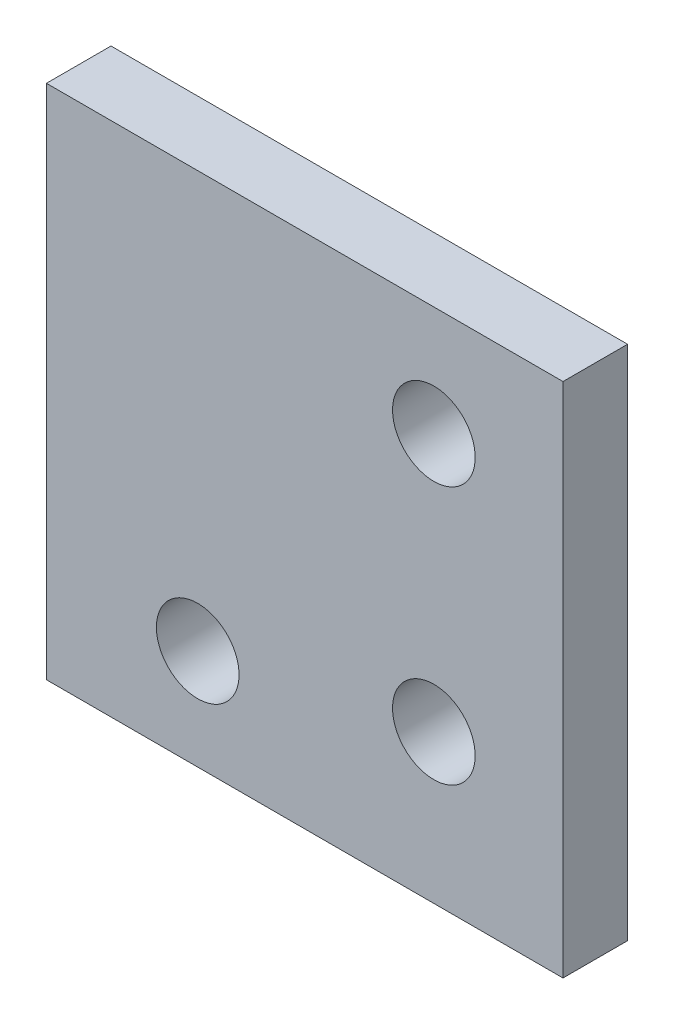
ISO-10303-21;
HEADER;
FILE_DESCRIPTION(('STEP AP214'),'2;1');
FILE_NAME('part.step','',(''),(''),'','','');
FILE_SCHEMA(('AUTOMOTIVE_DESIGN { 1 0 10303 214 1 1 1 1 }'));
ENDSEC;
DATA;
#1=APPLICATION_CONTEXT('core data for automotive mechanical design processes');
#2=APPLICATION_PROTOCOL_DEFINITION('international standard','automotive_design',2000,#1);
#3=PRODUCT_CONTEXT('',#1,'mechanical');
#4=PRODUCT('Part','Part','',(#3));
#5=PRODUCT_RELATED_PRODUCT_CATEGORY('part','',(#4));
#6=PRODUCT_DEFINITION_FORMATION('','',#4);
#7=PRODUCT_DEFINITION_CONTEXT('part definition',#1,'design');
#8=PRODUCT_DEFINITION('design','',#6,#7);
#9=PRODUCT_DEFINITION_SHAPE('','',#8);
#10=(LENGTH_UNIT() NAMED_UNIT(*) SI_UNIT(.MILLI.,.METRE.));
#11=(NAMED_UNIT(*) PLANE_ANGLE_UNIT() SI_UNIT($,.RADIAN.));
#12=(NAMED_UNIT(*) SI_UNIT($,.STERADIAN.) SOLID_ANGLE_UNIT());
#13=UNCERTAINTY_MEASURE_WITH_UNIT(LENGTH_MEASURE(1.E-05),#10,'distance_accuracy_value','');
#14=(GEOMETRIC_REPRESENTATION_CONTEXT(3) GLOBAL_UNCERTAINTY_ASSIGNED_CONTEXT((#13)) GLOBAL_UNIT_ASSIGNED_CONTEXT((#10,
#11,#12)) REPRESENTATION_CONTEXT('',''));
#15=CARTESIAN_POINT('',(0.,0.,0.));
#16=DIRECTION('',(0.,0.,1.));
#17=DIRECTION('',(1.,0.,0.));
#18=AXIS2_PLACEMENT_3D('',#15,#16,#17);
#19=CARTESIAN_POINT('',(12.7,-12.7,3.175));
#20=DIRECTION('',(-1.,0.,0.));
#21=DIRECTION('',(0.,0.,1.));
#22=AXIS2_PLACEMENT_3D('',#19,#20,#21);
#23=PLANE('',#22);
#24=DIRECTION('',(0.,1.,0.));
#25=VECTOR('',#24,1.);
#26=CARTESIAN_POINT('',(12.7,-12.7,0.));
#27=LINE('',#26,#25);
#28=CARTESIAN_POINT('',(12.7,-12.7,0.));
#29=VERTEX_POINT('',#28);
#30=CARTESIAN_POINT('',(12.7,12.7,0.));
#31=VERTEX_POINT('',#30);
#32=EDGE_CURVE('E110',#29,#31,#27,.T.);
#33=ORIENTED_EDGE('',*,*,#32,.T.);
#34=DIRECTION('',(0.,0.,-1.));
#35=VECTOR('',#34,1.);
#36=CARTESIAN_POINT('',(12.7,12.7,3.175));
#37=LINE('',#36,#35);
#38=CARTESIAN_POINT('',(12.7,12.7,3.175));
#39=VERTEX_POINT('',#38);
#40=EDGE_CURVE('E11',#39,#31,#37,.T.);
#41=ORIENTED_EDGE('',*,*,#40,.F.);
#42=DIRECTION('',(0.,1.,0.));
#43=VECTOR('',#42,1.);
#44=CARTESIAN_POINT('',(12.7,-12.7,3.175));
#45=LINE('',#44,#43);
#46=CARTESIAN_POINT('',(12.7,-12.7,3.175));
#47=VERTEX_POINT('',#46);
#48=EDGE_CURVE('E94',#47,#39,#45,.T.);
#49=ORIENTED_EDGE('',*,*,#48,.F.);
#50=DIRECTION('',(0.,0.,-1.));
#51=VECTOR('',#50,1.);
#52=CARTESIAN_POINT('',(12.7,-12.7,3.175));
#53=LINE('',#52,#51);
#54=EDGE_CURVE('E103',#47,#29,#53,.T.);
#55=ORIENTED_EDGE('',*,*,#54,.T.);
#56=EDGE_LOOP('',(#33,#41,#49,#55));
#57=FACE_BOUND('',#56,.T.);
#58=ADVANCED_FACE('F39',(#57),#23,.F.);
#59=CARTESIAN_POINT('',(-12.7,12.7,3.175));
#60=DIRECTION('',(0.,-1.,0.));
#61=DIRECTION('',(0.,0.,-1.));
#62=AXIS2_PLACEMENT_3D('',#59,#60,#61);
#63=PLANE('',#62);
#64=DIRECTION('',(-1.,0.,0.));
#65=VECTOR('',#64,1.);
#66=CARTESIAN_POINT('',(-12.7,12.7,0.));
#67=LINE('',#66,#65);
#68=CARTESIAN_POINT('',(-12.7,12.7,0.));
#69=VERTEX_POINT('',#68);
#70=EDGE_CURVE('E98',#31,#69,#67,.T.);
#71=ORIENTED_EDGE('',*,*,#70,.T.);
#72=DIRECTION('',(0.,0.,-1.));
#73=VECTOR('',#72,1.);
#74=CARTESIAN_POINT('',(-12.7,12.7,3.175));
#75=LINE('',#74,#73);
#76=CARTESIAN_POINT('',(-12.7,12.7,3.175));
#77=VERTEX_POINT('',#76);
#78=EDGE_CURVE('E49',#77,#69,#75,.T.);
#79=ORIENTED_EDGE('',*,*,#78,.F.);
#80=DIRECTION('',(-1.,0.,0.));
#81=VECTOR('',#80,1.);
#82=CARTESIAN_POINT('',(-12.7,12.7,3.175));
#83=LINE('',#82,#81);
#84=EDGE_CURVE('E90',#39,#77,#83,.T.);
#85=ORIENTED_EDGE('',*,*,#84,.F.);
#86=ORIENTED_EDGE('',*,*,#40,.T.);
#87=EDGE_LOOP('',(#71,#79,#85,#86));
#88=FACE_BOUND('',#87,.T.);
#89=ADVANCED_FACE('F100',(#88),#63,.F.);
#90=CARTESIAN_POINT('',(-12.7,-12.7,3.175));
#91=DIRECTION('',(1.,0.,0.));
#92=DIRECTION('',(0.,0.,-1.));
#93=AXIS2_PLACEMENT_3D('',#90,#91,#92);
#94=PLANE('',#93);
#95=DIRECTION('',(0.,-1.,0.));
#96=VECTOR('',#95,1.);
#97=CARTESIAN_POINT('',(-12.7,-12.7,0.));
#98=LINE('',#97,#96);
#99=CARTESIAN_POINT('',(-12.7,-12.7,0.));
#100=VERTEX_POINT('',#99);
#101=EDGE_CURVE('E78',#69,#100,#98,.T.);
#102=ORIENTED_EDGE('',*,*,#101,.T.);
#103=DIRECTION('',(0.,0.,-1.));
#104=VECTOR('',#103,1.);
#105=CARTESIAN_POINT('',(-12.7,-12.7,3.175));
#106=LINE('',#105,#104);
#107=CARTESIAN_POINT('',(-12.7,-12.7,3.175));
#108=VERTEX_POINT('',#107);
#109=EDGE_CURVE('E97',#108,#100,#106,.T.);
#110=ORIENTED_EDGE('',*,*,#109,.F.);
#111=DIRECTION('',(0.,-1.,0.));
#112=VECTOR('',#111,1.);
#113=CARTESIAN_POINT('',(-12.7,-12.7,3.175));
#114=LINE('',#113,#112);
#115=EDGE_CURVE('E95',#77,#108,#114,.T.);
#116=ORIENTED_EDGE('',*,*,#115,.F.);
#117=ORIENTED_EDGE('',*,*,#78,.T.);
#118=EDGE_LOOP('',(#102,#110,#116,#117));
#119=FACE_BOUND('',#118,.T.);
#120=ADVANCED_FACE('F101',(#119),#94,.F.);
#121=CARTESIAN_POINT('',(-12.7,-12.7,3.175));
#122=DIRECTION('',(0.,1.,0.));
#123=DIRECTION('',(0.,0.,1.));
#124=AXIS2_PLACEMENT_3D('',#121,#122,#123);
#125=PLANE('',#124);
#126=DIRECTION('',(1.,0.,0.));
#127=VECTOR('',#126,1.);
#128=CARTESIAN_POINT('',(-12.7,-12.7,0.));
#129=LINE('',#128,#127);
#130=EDGE_CURVE('E84',#100,#29,#129,.T.);
#131=ORIENTED_EDGE('',*,*,#130,.T.);
#132=ORIENTED_EDGE('',*,*,#54,.F.);
#133=DIRECTION('',(1.,0.,0.));
#134=VECTOR('',#133,1.);
#135=CARTESIAN_POINT('',(-12.7,-12.7,3.175));
#136=LINE('',#135,#134);
#137=EDGE_CURVE('E56',#108,#47,#136,.T.);
#138=ORIENTED_EDGE('',*,*,#137,.F.);
#139=ORIENTED_EDGE('',*,*,#109,.T.);
#140=EDGE_LOOP('',(#131,#132,#138,#139));
#141=FACE_BOUND('',#140,.T.);
#142=ADVANCED_FACE('F136',(#141),#125,.F.);
#143=CARTESIAN_POINT('',(0.,0.,3.175));
#144=DIRECTION('',(0.,0.,-1.));
#145=DIRECTION('',(-1.,0.,0.));
#146=AXIS2_PLACEMENT_3D('',#143,#144,#145);
#147=PLANE('',#146);
#148=CARTESIAN_POINT('',(-5.2605122421211,-7.75635386460882,3.175));
#149=DIRECTION('',(0.,0.,-1.));
#150=DIRECTION('',(-1.,0.,0.));
#151=AXIS2_PLACEMENT_3D('',#148,#149,#150);
#152=CIRCLE('',#151,2.03199999999998);
#153=CARTESIAN_POINT('',(-7.29251224212107,-7.75635386460882,3.175));
#154=VERTEX_POINT('',#153);
#155=EDGE_CURVE('E109',#154,#154,#152,.T.);
#156=ORIENTED_EDGE('',*,*,#155,.T.);
#157=EDGE_LOOP('',(#156));
#158=FACE_BOUND('',#157,.T.);
#159=CARTESIAN_POINT('',(6.35000000001718,-5.39686610674717,3.175));
#160=DIRECTION('',(0.,0.,-1.));
#161=DIRECTION('',(-1.,0.,0.));
#162=AXIS2_PLACEMENT_3D('',#159,#160,#161);
#163=CIRCLE('',#162,2.03199999999998);
#164=CARTESIAN_POINT('',(4.3180000000172,-5.39686610674717,3.175));
#165=VERTEX_POINT('',#164);
#166=EDGE_CURVE('E159',#165,#165,#163,.T.);
#167=ORIENTED_EDGE('',*,*,#166,.T.);
#168=EDGE_LOOP('',(#167));
#169=FACE_BOUND('',#168,.T.);
#170=CARTESIAN_POINT('',(6.35000000001718,7.30313389325283,3.175));
#171=DIRECTION('',(0.,0.,-1.));
#172=DIRECTION('',(-1.,0.,0.));
#173=AXIS2_PLACEMENT_3D('',#170,#171,#172);
#174=CIRCLE('',#173,2.03199999999998);
#175=CARTESIAN_POINT('',(4.3180000000172,7.30313389325283,3.175));
#176=VERTEX_POINT('',#175);
#177=EDGE_CURVE('E170',#176,#176,#174,.T.);
#178=ORIENTED_EDGE('',*,*,#177,.T.);
#179=EDGE_LOOP('',(#178));
#180=FACE_BOUND('',#179,.T.);
#181=ORIENTED_EDGE('',*,*,#48,.T.);
#182=ORIENTED_EDGE('',*,*,#84,.T.);
#183=ORIENTED_EDGE('',*,*,#115,.T.);
#184=ORIENTED_EDGE('',*,*,#137,.T.);
#185=EDGE_LOOP('',(#181,#182,#183,#184));
#186=FACE_BOUND('',#185,.T.);
#187=ADVANCED_FACE('F89',(#158,#169,#180,#186),#147,.F.);
#188=CARTESIAN_POINT('',(0.,0.,0.));
#189=DIRECTION('',(0.,0.,-1.));
#190=DIRECTION('',(-1.,0.,0.));
#191=AXIS2_PLACEMENT_3D('',#188,#189,#190);
#192=PLANE('',#191);
#193=CARTESIAN_POINT('',(-5.2605122421211,-7.75635386460882,-1.20000000001889E-05));
#194=DIRECTION('',(0.,0.,-1.));
#195=DIRECTION('',(-1.,0.,0.));
#196=AXIS2_PLACEMENT_3D('',#193,#194,#195);
#197=CIRCLE('',#196,2.03199999999998);
#198=CARTESIAN_POINT('',(-7.29251224212107,-7.75635386460883,-1.20000000001889E-05));
#199=VERTEX_POINT('',#198);
#200=EDGE_CURVE('E155',#199,#199,#197,.T.);
#201=ORIENTED_EDGE('',*,*,#200,.F.);
#202=EDGE_LOOP('',(#201));
#203=FACE_BOUND('',#202,.T.);
#204=CARTESIAN_POINT('',(6.35000000001718,-5.39686610674717,-1.20000000001889E-05));
#205=DIRECTION('',(0.,0.,-1.));
#206=DIRECTION('',(-1.,0.,0.));
#207=AXIS2_PLACEMENT_3D('',#204,#205,#206);
#208=CIRCLE('',#207,2.03199999999998);
#209=CARTESIAN_POINT('',(4.3180000000172,-5.39686610674717,-1.20000000001889E-05));
#210=VERTEX_POINT('',#209);
#211=EDGE_CURVE('E156',#210,#210,#208,.T.);
#212=ORIENTED_EDGE('',*,*,#211,.F.);
#213=EDGE_LOOP('',(#212));
#214=FACE_BOUND('',#213,.T.);
#215=CARTESIAN_POINT('',(6.35000000001718,7.30313389325283,-1.20000000001889E-05));
#216=DIRECTION('',(0.,0.,-1.));
#217=DIRECTION('',(-1.,0.,0.));
#218=AXIS2_PLACEMENT_3D('',#215,#216,#217);
#219=CIRCLE('',#218,2.03199999999998);
#220=CARTESIAN_POINT('',(4.3180000000172,7.30313389325283,-1.20000000001889E-05));
#221=VERTEX_POINT('',#220);
#222=EDGE_CURVE('E116',#221,#221,#219,.T.);
#223=ORIENTED_EDGE('',*,*,#222,.F.);
#224=EDGE_LOOP('',(#223));
#225=FACE_BOUND('',#224,.T.);
#226=ORIENTED_EDGE('',*,*,#32,.F.);
#227=ORIENTED_EDGE('',*,*,#130,.F.);
#228=ORIENTED_EDGE('',*,*,#101,.F.);
#229=ORIENTED_EDGE('',*,*,#70,.F.);
#230=EDGE_LOOP('',(#226,#227,#228,#229));
#231=FACE_BOUND('',#230,.T.);
#232=ADVANCED_FACE('F127',(#203,#214,#225,#231),#192,.T.);
#233=CARTESIAN_POINT('',(6.35000000001718,7.30313389325283,3.175));
#234=DIRECTION('',(0.,0.,-1.));
#235=DIRECTION('',(-1.,0.,0.));
#236=AXIS2_PLACEMENT_3D('',#233,#234,#235);
#237=CYLINDRICAL_SURFACE('',#236,2.03199999999998);
#238=ORIENTED_EDGE('',*,*,#177,.F.);
#239=EDGE_LOOP('',(#238));
#240=FACE_BOUND('',#239,.T.);
#241=ORIENTED_EDGE('',*,*,#222,.T.);
#242=EDGE_LOOP('',(#241));
#243=FACE_BOUND('',#242,.T.);
#244=ADVANCED_FACE('F137',(#240,#243),#237,.F.);
#245=CARTESIAN_POINT('',(6.35000000001718,-5.39686610674717,3.175));
#246=DIRECTION('',(0.,0.,-1.));
#247=DIRECTION('',(-1.,0.,0.));
#248=AXIS2_PLACEMENT_3D('',#245,#246,#247);
#249=CYLINDRICAL_SURFACE('',#248,2.03199999999998);
#250=ORIENTED_EDGE('',*,*,#166,.F.);
#251=EDGE_LOOP('',(#250));
#252=FACE_BOUND('',#251,.T.);
#253=ORIENTED_EDGE('',*,*,#211,.T.);
#254=EDGE_LOOP('',(#253));
#255=FACE_BOUND('',#254,.T.);
#256=ADVANCED_FACE('F184',(#252,#255),#249,.F.);
#257=CARTESIAN_POINT('',(-5.2605122421211,-7.75635386460882,3.175));
#258=DIRECTION('',(0.,0.,-1.));
#259=DIRECTION('',(-1.,0.,0.));
#260=AXIS2_PLACEMENT_3D('',#257,#258,#259);
#261=CYLINDRICAL_SURFACE('',#260,2.03199999999998);
#262=ORIENTED_EDGE('',*,*,#155,.F.);
#263=EDGE_LOOP('',(#262));
#264=FACE_BOUND('',#263,.T.);
#265=ORIENTED_EDGE('',*,*,#200,.T.);
#266=EDGE_LOOP('',(#265));
#267=FACE_BOUND('',#266,.T.);
#268=ADVANCED_FACE('F171',(#264,#267),#261,.F.);
#269=CLOSED_SHELL('',(#58,#89,#120,#142,#187,#232,#244,#256,#268));
#270=MANIFOLD_SOLID_BREP('B2',#269);
#271=ADVANCED_BREP_SHAPE_REPRESENTATION('',(#18,#270),#14);
#272=SHAPE_DEFINITION_REPRESENTATION(#9,#271);
ENDSEC;
END-ISO-10303-21;
